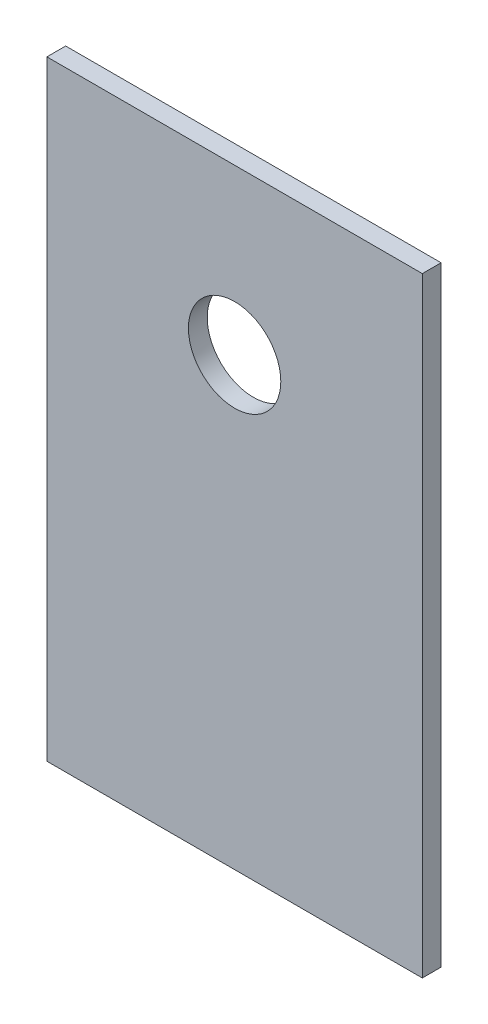
ISO-10303-21;
HEADER;
FILE_DESCRIPTION(('STEP AP214'),'2;1');
FILE_NAME('part.step','',(''),(''),'','','');
FILE_SCHEMA(('AUTOMOTIVE_DESIGN { 1 0 10303 214 1 1 1 1 }'));
ENDSEC;
DATA;
#1=APPLICATION_CONTEXT('core data for automotive mechanical design processes');
#2=APPLICATION_PROTOCOL_DEFINITION('international standard','automotive_design',2000,#1);
#3=PRODUCT_CONTEXT('',#1,'mechanical');
#4=PRODUCT('Part','Part','',(#3));
#5=PRODUCT_RELATED_PRODUCT_CATEGORY('part','',(#4));
#6=PRODUCT_DEFINITION_FORMATION('','',#4);
#7=PRODUCT_DEFINITION_CONTEXT('part definition',#1,'design');
#8=PRODUCT_DEFINITION('design','',#6,#7);
#9=PRODUCT_DEFINITION_SHAPE('','',#8);
#10=(LENGTH_UNIT() NAMED_UNIT(*) SI_UNIT(.MILLI.,.METRE.));
#11=(NAMED_UNIT(*) PLANE_ANGLE_UNIT() SI_UNIT($,.RADIAN.));
#12=(NAMED_UNIT(*) SI_UNIT($,.STERADIAN.) SOLID_ANGLE_UNIT());
#13=UNCERTAINTY_MEASURE_WITH_UNIT(LENGTH_MEASURE(1.E-05),#10,'distance_accuracy_value','');
#14=(GEOMETRIC_REPRESENTATION_CONTEXT(3) GLOBAL_UNCERTAINTY_ASSIGNED_CONTEXT((#13)) GLOBAL_UNIT_ASSIGNED_CONTEXT((#10,
#11,#12)) REPRESENTATION_CONTEXT('',''));
#15=CARTESIAN_POINT('',(0.,0.,0.));
#16=DIRECTION('',(0.,0.,1.));
#17=DIRECTION('',(1.,0.,0.));
#18=AXIS2_PLACEMENT_3D('',#15,#16,#17);
#19=CARTESIAN_POINT('',(50.8,-82.55,5.08));
#20=DIRECTION('',(-1.,0.,0.));
#21=DIRECTION('',(0.,0.,1.));
#22=AXIS2_PLACEMENT_3D('',#19,#20,#21);
#23=PLANE('',#22);
#24=DIRECTION('',(0.,1.,0.));
#25=VECTOR('',#24,1.);
#26=CARTESIAN_POINT('',(50.8,-82.55,0.));
#27=LINE('',#26,#25);
#28=CARTESIAN_POINT('',(50.8,-82.55,0.));
#29=VERTEX_POINT('',#28);
#30=CARTESIAN_POINT('',(50.8,82.55,0.));
#31=VERTEX_POINT('',#30);
#32=EDGE_CURVE('E107',#29,#31,#27,.T.);
#33=ORIENTED_EDGE('',*,*,#32,.T.);
#34=DIRECTION('',(0.,0.,-1.));
#35=VECTOR('',#34,1.);
#36=CARTESIAN_POINT('',(50.8,82.55,5.08));
#37=LINE('',#36,#35);
#38=CARTESIAN_POINT('',(50.8,82.55,5.08));
#39=VERTEX_POINT('',#38);
#40=EDGE_CURVE('E11',#39,#31,#37,.T.);
#41=ORIENTED_EDGE('',*,*,#40,.F.);
#42=DIRECTION('',(0.,1.,0.));
#43=VECTOR('',#42,1.);
#44=CARTESIAN_POINT('',(50.8,-82.55,5.08));
#45=LINE('',#44,#43);
#46=CARTESIAN_POINT('',(50.8,-82.55,5.08));
#47=VERTEX_POINT('',#46);
#48=EDGE_CURVE('E91',#47,#39,#45,.T.);
#49=ORIENTED_EDGE('',*,*,#48,.F.);
#50=DIRECTION('',(0.,0.,-1.));
#51=VECTOR('',#50,1.);
#52=CARTESIAN_POINT('',(50.8,-82.55,5.08));
#53=LINE('',#52,#51);
#54=EDGE_CURVE('E103',#47,#29,#53,.T.);
#55=ORIENTED_EDGE('',*,*,#54,.T.);
#56=EDGE_LOOP('',(#33,#41,#49,#55));
#57=FACE_BOUND('',#56,.T.);
#58=ADVANCED_FACE('F39',(#57),#23,.F.);
#59=CARTESIAN_POINT('',(-50.8,82.55,5.08));
#60=DIRECTION('',(0.,-1.,0.));
#61=DIRECTION('',(0.,0.,-1.));
#62=AXIS2_PLACEMENT_3D('',#59,#60,#61);
#63=PLANE('',#62);
#64=DIRECTION('',(-1.,0.,0.));
#65=VECTOR('',#64,1.);
#66=CARTESIAN_POINT('',(-50.8,82.55,0.));
#67=LINE('',#66,#65);
#68=CARTESIAN_POINT('',(-50.8,82.55,0.));
#69=VERTEX_POINT('',#68);
#70=EDGE_CURVE('E96',#31,#69,#67,.T.);
#71=ORIENTED_EDGE('',*,*,#70,.T.);
#72=DIRECTION('',(0.,0.,-1.));
#73=VECTOR('',#72,1.);
#74=CARTESIAN_POINT('',(-50.8,82.55,5.08));
#75=LINE('',#74,#73);
#76=CARTESIAN_POINT('',(-50.8,82.55,5.08));
#77=VERTEX_POINT('',#76);
#78=EDGE_CURVE('E48',#77,#69,#75,.T.);
#79=ORIENTED_EDGE('',*,*,#78,.F.);
#80=DIRECTION('',(-1.,0.,0.));
#81=VECTOR('',#80,1.);
#82=CARTESIAN_POINT('',(-50.8,82.55,5.08));
#83=LINE('',#82,#81);
#84=EDGE_CURVE('E86',#39,#77,#83,.T.);
#85=ORIENTED_EDGE('',*,*,#84,.F.);
#86=ORIENTED_EDGE('',*,*,#40,.T.);
#87=EDGE_LOOP('',(#71,#79,#85,#86));
#88=FACE_BOUND('',#87,.T.);
#89=ADVANCED_FACE('F95',(#88),#63,.F.);
#90=CARTESIAN_POINT('',(-50.8,-82.55,5.08));
#91=DIRECTION('',(1.,0.,0.));
#92=DIRECTION('',(0.,0.,-1.));
#93=AXIS2_PLACEMENT_3D('',#90,#91,#92);
#94=PLANE('',#93);
#95=DIRECTION('',(0.,-1.,0.));
#96=VECTOR('',#95,1.);
#97=CARTESIAN_POINT('',(-50.8,-82.55,0.));
#98=LINE('',#97,#96);
#99=CARTESIAN_POINT('',(-50.8,-82.55,0.));
#100=VERTEX_POINT('',#99);
#101=EDGE_CURVE('E73',#69,#100,#98,.T.);
#102=ORIENTED_EDGE('',*,*,#101,.T.);
#103=DIRECTION('',(0.,0.,-1.));
#104=VECTOR('',#103,1.);
#105=CARTESIAN_POINT('',(-50.8,-82.55,5.08));
#106=LINE('',#105,#104);
#107=CARTESIAN_POINT('',(-50.8,-82.55,5.08));
#108=VERTEX_POINT('',#107);
#109=EDGE_CURVE('E98',#108,#100,#106,.T.);
#110=ORIENTED_EDGE('',*,*,#109,.F.);
#111=DIRECTION('',(0.,-1.,0.));
#112=VECTOR('',#111,1.);
#113=CARTESIAN_POINT('',(-50.8,-82.55,5.08));
#114=LINE('',#113,#112);
#115=EDGE_CURVE('E89',#77,#108,#114,.T.);
#116=ORIENTED_EDGE('',*,*,#115,.F.);
#117=ORIENTED_EDGE('',*,*,#78,.T.);
#118=EDGE_LOOP('',(#102,#110,#116,#117));
#119=FACE_BOUND('',#118,.T.);
#120=ADVANCED_FACE('F99',(#119),#94,.F.);
#121=CARTESIAN_POINT('',(-50.8,-82.55,5.08));
#122=DIRECTION('',(0.,1.,0.));
#123=DIRECTION('',(0.,0.,1.));
#124=AXIS2_PLACEMENT_3D('',#121,#122,#123);
#125=PLANE('',#124);
#126=DIRECTION('',(1.,0.,0.));
#127=VECTOR('',#126,1.);
#128=CARTESIAN_POINT('',(-50.8,-82.55,0.));
#129=LINE('',#128,#127);
#130=EDGE_CURVE('E79',#100,#29,#129,.T.);
#131=ORIENTED_EDGE('',*,*,#130,.T.);
#132=ORIENTED_EDGE('',*,*,#54,.F.);
#133=DIRECTION('',(1.,0.,0.));
#134=VECTOR('',#133,1.);
#135=CARTESIAN_POINT('',(-50.8,-82.55,5.08));
#136=LINE('',#135,#134);
#137=EDGE_CURVE('E56',#108,#47,#136,.T.);
#138=ORIENTED_EDGE('',*,*,#137,.F.);
#139=ORIENTED_EDGE('',*,*,#109,.T.);
#140=EDGE_LOOP('',(#131,#132,#138,#139));
#141=FACE_BOUND('',#140,.T.);
#142=ADVANCED_FACE('F121',(#141),#125,.F.);
#143=CARTESIAN_POINT('',(0.,0.,5.08));
#144=DIRECTION('',(0.,0.,-1.));
#145=DIRECTION('',(-1.,0.,0.));
#146=AXIS2_PLACEMENT_3D('',#143,#144,#145);
#147=PLANE('',#146);
#148=CARTESIAN_POINT('',(0.,38.1,5.08));
#149=DIRECTION('',(0.,0.,-1.));
#150=DIRECTION('',(-1.,0.,0.));
#151=AXIS2_PLACEMENT_3D('',#148,#149,#150);
#152=CIRCLE('',#151,12.500000019);
#153=CARTESIAN_POINT('',(-12.500000019,38.1,5.08));
#154=VERTEX_POINT('',#153);
#155=EDGE_CURVE('E111',#154,#154,#152,.T.);
#156=ORIENTED_EDGE('',*,*,#155,.T.);
#157=EDGE_LOOP('',(#156));
#158=FACE_BOUND('',#157,.T.);
#159=ORIENTED_EDGE('',*,*,#48,.T.);
#160=ORIENTED_EDGE('',*,*,#84,.T.);
#161=ORIENTED_EDGE('',*,*,#115,.T.);
#162=ORIENTED_EDGE('',*,*,#137,.T.);
#163=EDGE_LOOP('',(#159,#160,#161,#162));
#164=FACE_BOUND('',#163,.T.);
#165=ADVANCED_FACE('F87',(#158,#164),#147,.F.);
#166=CARTESIAN_POINT('',(0.,0.,0.));
#167=DIRECTION('',(0.,0.,-1.));
#168=DIRECTION('',(-1.,0.,0.));
#169=AXIS2_PLACEMENT_3D('',#166,#167,#168);
#170=PLANE('',#169);
#171=CARTESIAN_POINT('',(0.,38.1,0.));
#172=DIRECTION('',(0.,0.,1.));
#173=DIRECTION('',(1.,0.,0.));
#174=AXIS2_PLACEMENT_3D('',#171,#172,#173);
#175=CIRCLE('',#174,12.500000019);
#176=CARTESIAN_POINT('',(12.500000019,38.1,0.));
#177=VERTEX_POINT('',#176);
#178=EDGE_CURVE('E131',#177,#177,#175,.T.);
#179=ORIENTED_EDGE('',*,*,#178,.T.);
#180=EDGE_LOOP('',(#179));
#181=FACE_BOUND('',#180,.T.);
#182=ORIENTED_EDGE('',*,*,#32,.F.);
#183=ORIENTED_EDGE('',*,*,#130,.F.);
#184=ORIENTED_EDGE('',*,*,#101,.F.);
#185=ORIENTED_EDGE('',*,*,#70,.F.);
#186=EDGE_LOOP('',(#182,#183,#184,#185));
#187=FACE_BOUND('',#186,.T.);
#188=ADVANCED_FACE('F124',(#181,#187),#170,.T.);
#189=CARTESIAN_POINT('',(0.,38.1,0.));
#190=DIRECTION('',(0.,0.,1.));
#191=DIRECTION('',(1.,0.,0.));
#192=AXIS2_PLACEMENT_3D('',#189,#190,#191);
#193=CYLINDRICAL_SURFACE('',#192,12.500000019);
#194=ORIENTED_EDGE('',*,*,#178,.F.);
#195=EDGE_LOOP('',(#194));
#196=FACE_BOUND('',#195,.T.);
#197=ORIENTED_EDGE('',*,*,#155,.F.);
#198=EDGE_LOOP('',(#197));
#199=FACE_BOUND('',#198,.T.);
#200=ADVANCED_FACE('F137',(#196,#199),#193,.F.);
#201=CLOSED_SHELL('',(#58,#89,#120,#142,#165,#188,#200));
#202=MANIFOLD_SOLID_BREP('B2',#201);
#203=ADVANCED_BREP_SHAPE_REPRESENTATION('',(#18,#202),#14);
#204=SHAPE_DEFINITION_REPRESENTATION(#9,#203);
ENDSEC;
END-ISO-10303-21;
